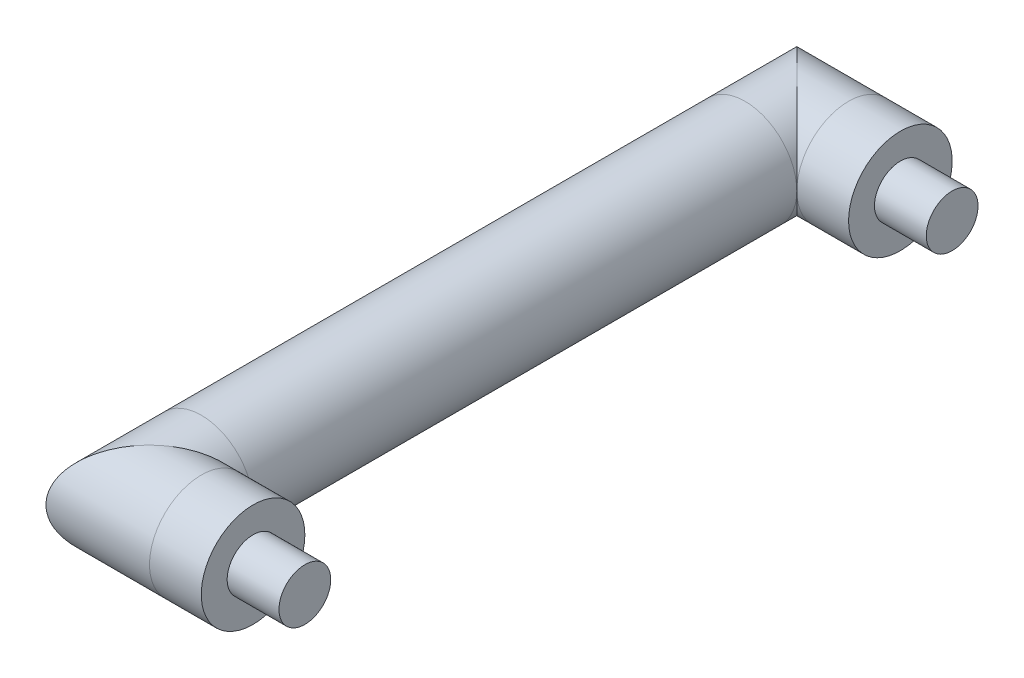
ISO-10303-21;
HEADER;
FILE_DESCRIPTION(('STEP AP214'),'2;1');
FILE_NAME('part.step','',(''),(''),'','','');
FILE_SCHEMA(('AUTOMOTIVE_DESIGN { 1 0 10303 214 1 1 1 1 }'));
ENDSEC;
DATA;
#1=APPLICATION_CONTEXT('core data for automotive mechanical design processes');
#2=APPLICATION_PROTOCOL_DEFINITION('international standard','automotive_design',2000,#1);
#3=PRODUCT_CONTEXT('',#1,'mechanical');
#4=PRODUCT('Part','Part','',(#3));
#5=PRODUCT_RELATED_PRODUCT_CATEGORY('part','',(#4));
#6=PRODUCT_DEFINITION_FORMATION('','',#4);
#7=PRODUCT_DEFINITION_CONTEXT('part definition',#1,'design');
#8=PRODUCT_DEFINITION('design','',#6,#7);
#9=PRODUCT_DEFINITION_SHAPE('','',#8);
#10=(LENGTH_UNIT() NAMED_UNIT(*) SI_UNIT(.MILLI.,.METRE.));
#11=(NAMED_UNIT(*) PLANE_ANGLE_UNIT() SI_UNIT($,.RADIAN.));
#12=(NAMED_UNIT(*) SI_UNIT($,.STERADIAN.) SOLID_ANGLE_UNIT());
#13=UNCERTAINTY_MEASURE_WITH_UNIT(LENGTH_MEASURE(1.E-05),#10,'distance_accuracy_value','');
#14=(GEOMETRIC_REPRESENTATION_CONTEXT(3) GLOBAL_UNCERTAINTY_ASSIGNED_CONTEXT((#13)) GLOBAL_UNIT_ASSIGNED_CONTEXT((#10,
#11,#12)) REPRESENTATION_CONTEXT('',''));
#15=CARTESIAN_POINT('',(0.,0.,0.));
#16=DIRECTION('',(0.,0.,1.));
#17=DIRECTION('',(1.,0.,0.));
#18=AXIS2_PLACEMENT_3D('',#15,#16,#17);
#19=CARTESIAN_POINT('',(0.,0.,0.));
#20=DIRECTION('',(1.,0.,0.));
#21=DIRECTION('',(0.,0.,-1.));
#22=AXIS2_PLACEMENT_3D('',#19,#20,#21);
#23=PLANE('',#22);
#24=CARTESIAN_POINT('',(0.,0.,0.));
#25=DIRECTION('',(1.,0.,0.));
#26=DIRECTION('',(0.,0.,-1.));
#27=AXIS2_PLACEMENT_3D('',#24,#25,#26);
#28=CIRCLE('',#27,10.);
#29=CARTESIAN_POINT('',(0.,0.,-10.));
#30=VERTEX_POINT('',#29);
#31=EDGE_CURVE('E11',#30,#30,#28,.T.);
#32=ORIENTED_EDGE('',*,*,#31,.F.);
#33=EDGE_LOOP('',(#32));
#34=FACE_BOUND('',#33,.T.);
#35=CARTESIAN_POINT('',(0.,0.,0.));
#36=DIRECTION('',(1.,0.,0.));
#37=DIRECTION('',(0.,0.,-1.));
#38=AXIS2_PLACEMENT_3D('',#35,#36,#37);
#39=CIRCLE('',#38,20.);
#40=CARTESIAN_POINT('',(0.,0.,-20.));
#41=VERTEX_POINT('',#40);
#42=EDGE_CURVE('E56',#41,#41,#39,.T.);
#43=ORIENTED_EDGE('',*,*,#42,.T.);
#44=EDGE_LOOP('',(#43));
#45=FACE_BOUND('',#44,.T.);
#46=ADVANCED_FACE('F47',(#34,#45),#23,.T.);
#47=CARTESIAN_POINT('',(-40.,0.,22.1));
#48=DIRECTION('',(0.,0.,-1.));
#49=DIRECTION('',(-1.,0.,0.));
#50=AXIS2_PLACEMENT_3D('',#47,#48,#49);
#51=CYLINDRICAL_SURFACE('',#50,20.);
#52=CARTESIAN_POINT('',(-40.,0.,-20.0000000000001));
#53=DIRECTION('',(0.,0.,1.));
#54=DIRECTION('',(1.,0.,0.));
#55=AXIS2_PLACEMENT_3D('',#52,#53,#54);
#56=CIRCLE('',#55,20.);
#57=CARTESIAN_POINT('',(-20.,0.,-20.));
#58=VERTEX_POINT('',#57);
#59=EDGE_CURVE('E50',#58,#58,#56,.T.);
#60=ORIENTED_EDGE('',*,*,#59,.T.);
#61=CARTESIAN_POINT('',(-40.,0.,0.));
#62=DIRECTION('',(-0.707106781186548,0.,-0.707106781186547));
#63=DIRECTION('',(-0.707106781186547,0.,0.707106781186548));
#64=AXIS2_PLACEMENT_3D('',#61,#62,#63);
#65=ELLIPSE('',#64,28.2842712474619,20.);
#66=EDGE_CURVE('E63',#58,#58,#65,.T.);
#67=ORIENTED_EDGE('',*,*,#66,.T.);
#68=EDGE_LOOP('',(#60,#67));
#69=FACE_BOUND('',#68,.T.);
#70=ADVANCED_FACE('F110',(#69),#51,.T.);
#71=CARTESIAN_POINT('',(-40.,0.,-20.0000000000001));
#72=DIRECTION('',(0.,0.,-1.));
#73=DIRECTION('',(-1.,0.,0.));
#74=AXIS2_PLACEMENT_3D('',#71,#72,#73);
#75=CYLINDRICAL_SURFACE('',#74,20.);
#76=ORIENTED_EDGE('',*,*,#59,.F.);
#77=EDGE_LOOP('',(#76));
#78=FACE_BOUND('',#77,.T.);
#79=CARTESIAN_POINT('',(-40.,0.,-230.));
#80=DIRECTION('',(0.,0.,1.));
#81=DIRECTION('',(1.,0.,0.));
#82=AXIS2_PLACEMENT_3D('',#79,#80,#81);
#83=CIRCLE('',#82,20.);
#84=CARTESIAN_POINT('',(-20.,0.,-230.));
#85=VERTEX_POINT('',#84);
#86=EDGE_CURVE('E83',#85,#85,#83,.T.);
#87=ORIENTED_EDGE('',*,*,#86,.T.);
#88=EDGE_LOOP('',(#87));
#89=FACE_BOUND('',#88,.T.);
#90=ADVANCED_FACE('F112',(#78,#89),#75,.T.);
#91=CARTESIAN_POINT('',(0.,0.,0.));
#92=DIRECTION('',(-1.,0.,0.));
#93=DIRECTION('',(0.,0.,1.));
#94=AXIS2_PLACEMENT_3D('',#91,#92,#93);
#95=CYLINDRICAL_SURFACE('',#94,20.);
#96=CARTESIAN_POINT('',(-19.9999999999999,0.,0.));
#97=DIRECTION('',(1.,0.,0.));
#98=DIRECTION('',(0.,0.,-1.));
#99=AXIS2_PLACEMENT_3D('',#96,#97,#98);
#100=CIRCLE('',#99,20.);
#101=EDGE_CURVE('E96',#58,#58,#100,.T.);
#102=ORIENTED_EDGE('',*,*,#101,.T.);
#103=EDGE_LOOP('',(#102));
#104=FACE_BOUND('',#103,.T.);
#105=ORIENTED_EDGE('',*,*,#42,.F.);
#106=EDGE_LOOP('',(#105));
#107=FACE_BOUND('',#106,.T.);
#108=ADVANCED_FACE('F115',(#104,#107),#95,.T.);
#109=CARTESIAN_POINT('',(-19.9999999999999,0.,0.));
#110=DIRECTION('',(-1.,0.,0.));
#111=DIRECTION('',(0.,0.,1.));
#112=AXIS2_PLACEMENT_3D('',#109,#110,#111);
#113=CYLINDRICAL_SURFACE('',#112,20.);
#114=ORIENTED_EDGE('',*,*,#101,.F.);
#115=ORIENTED_EDGE('',*,*,#66,.F.);
#116=EDGE_LOOP('',(#114,#115));
#117=FACE_BOUND('',#116,.T.);
#118=ADVANCED_FACE('F133',(#117),#113,.T.);
#119=CARTESIAN_POINT('',(20.,0.,0.));
#120=DIRECTION('',(-1.,0.,0.));
#121=DIRECTION('',(0.,0.,1.));
#122=AXIS2_PLACEMENT_3D('',#119,#120,#121);
#123=CYLINDRICAL_SURFACE('',#122,10.);
#124=CARTESIAN_POINT('',(20.,0.,0.));
#125=DIRECTION('',(1.,0.,0.));
#126=DIRECTION('',(0.,0.,-1.));
#127=AXIS2_PLACEMENT_3D('',#124,#125,#126);
#128=CIRCLE('',#127,10.);
#129=CARTESIAN_POINT('',(20.,0.,-10.));
#130=VERTEX_POINT('',#129);
#131=EDGE_CURVE('E92',#130,#130,#128,.T.);
#132=ORIENTED_EDGE('',*,*,#131,.F.);
#133=EDGE_LOOP('',(#132));
#134=FACE_BOUND('',#133,.T.);
#135=ORIENTED_EDGE('',*,*,#31,.T.);
#136=EDGE_LOOP('',(#135));
#137=FACE_BOUND('',#136,.T.);
#138=ADVANCED_FACE('F135',(#134,#137),#123,.T.);
#139=CARTESIAN_POINT('',(20.,0.,0.));
#140=DIRECTION('',(1.,0.,0.));
#141=DIRECTION('',(0.,0.,-1.));
#142=AXIS2_PLACEMENT_3D('',#139,#140,#141);
#143=PLANE('',#142);
#144=ORIENTED_EDGE('',*,*,#131,.T.);
#145=EDGE_LOOP('',(#144));
#146=FACE_BOUND('',#145,.T.);
#147=ADVANCED_FACE('F129',(#146),#143,.T.);
#148=CARTESIAN_POINT('',(0.,0.,-250.));
#149=DIRECTION('',(1.,0.,0.));
#150=DIRECTION('',(0.,0.,1.));
#151=AXIS2_PLACEMENT_3D('',#148,#149,#150);
#152=PLANE('',#151);
#153=CARTESIAN_POINT('',(0.,0.,-250.));
#154=DIRECTION('',(-1.,0.,0.));
#155=DIRECTION('',(0.,0.,1.));
#156=AXIS2_PLACEMENT_3D('',#153,#154,#155);
#157=CIRCLE('',#156,10.);
#158=CARTESIAN_POINT('',(0.,0.,-240.));
#159=VERTEX_POINT('',#158);
#160=EDGE_CURVE('E80',#159,#159,#157,.T.);
#161=ORIENTED_EDGE('',*,*,#160,.T.);
#162=EDGE_LOOP('',(#161));
#163=FACE_BOUND('',#162,.T.);
#164=CARTESIAN_POINT('',(0.,0.,-250.));
#165=DIRECTION('',(-1.,0.,0.));
#166=DIRECTION('',(0.,0.,1.));
#167=AXIS2_PLACEMENT_3D('',#164,#165,#166);
#168=CIRCLE('',#167,20.);
#169=CARTESIAN_POINT('',(0.,0.,-230.));
#170=VERTEX_POINT('',#169);
#171=EDGE_CURVE('E75',#170,#170,#168,.T.);
#172=ORIENTED_EDGE('',*,*,#171,.F.);
#173=EDGE_LOOP('',(#172));
#174=FACE_BOUND('',#173,.T.);
#175=ADVANCED_FACE('F122',(#163,#174),#152,.T.);
#176=CARTESIAN_POINT('',(-40.,0.,-272.1));
#177=DIRECTION('',(0.,0.,1.));
#178=DIRECTION('',(-1.,0.,0.));
#179=AXIS2_PLACEMENT_3D('',#176,#177,#178);
#180=CYLINDRICAL_SURFACE('',#179,20.);
#181=ORIENTED_EDGE('',*,*,#86,.F.);
#182=CARTESIAN_POINT('',(-40.,0.,-250.));
#183=DIRECTION('',(0.707106781186547,0.,-0.707106781186548));
#184=DIRECTION('',(-0.707106781186548,0.,-0.707106781186547));
#185=AXIS2_PLACEMENT_3D('',#182,#183,#184);
#186=ELLIPSE('',#185,28.2842712474619,20.);
#187=EDGE_CURVE('E72',#85,#85,#186,.T.);
#188=ORIENTED_EDGE('',*,*,#187,.F.);
#189=EDGE_LOOP('',(#181,#188));
#190=FACE_BOUND('',#189,.T.);
#191=ADVANCED_FACE('F119',(#190),#180,.T.);
#192=CARTESIAN_POINT('',(0.,0.,-250.));
#193=DIRECTION('',(-1.,0.,0.));
#194=DIRECTION('',(0.,0.,-1.));
#195=AXIS2_PLACEMENT_3D('',#192,#193,#194);
#196=CYLINDRICAL_SURFACE('',#195,20.);
#197=CARTESIAN_POINT('',(-19.9999999999999,0.,-250.));
#198=DIRECTION('',(-1.,0.,0.));
#199=DIRECTION('',(0.,0.,1.));
#200=AXIS2_PLACEMENT_3D('',#197,#198,#199);
#201=CIRCLE('',#200,20.);
#202=EDGE_CURVE('E69',#85,#85,#201,.T.);
#203=ORIENTED_EDGE('',*,*,#202,.F.);
#204=EDGE_LOOP('',(#203));
#205=FACE_BOUND('',#204,.T.);
#206=ORIENTED_EDGE('',*,*,#171,.T.);
#207=EDGE_LOOP('',(#206));
#208=FACE_BOUND('',#207,.T.);
#209=ADVANCED_FACE('F121',(#205,#208),#196,.T.);
#210=CARTESIAN_POINT('',(-19.9999999999999,0.,-250.));
#211=DIRECTION('',(-1.,0.,0.));
#212=DIRECTION('',(0.,0.,-1.));
#213=AXIS2_PLACEMENT_3D('',#210,#211,#212);
#214=CYLINDRICAL_SURFACE('',#213,20.);
#215=ORIENTED_EDGE('',*,*,#202,.T.);
#216=ORIENTED_EDGE('',*,*,#187,.T.);
#217=EDGE_LOOP('',(#215,#216));
#218=FACE_BOUND('',#217,.T.);
#219=ADVANCED_FACE('F70',(#218),#214,.T.);
#220=CARTESIAN_POINT('',(20.,0.,-250.));
#221=DIRECTION('',(-1.,0.,0.));
#222=DIRECTION('',(0.,0.,-1.));
#223=AXIS2_PLACEMENT_3D('',#220,#221,#222);
#224=CYLINDRICAL_SURFACE('',#223,10.);
#225=CARTESIAN_POINT('',(20.,0.,-250.));
#226=DIRECTION('',(-1.,0.,0.));
#227=DIRECTION('',(0.,0.,1.));
#228=AXIS2_PLACEMENT_3D('',#225,#226,#227);
#229=CIRCLE('',#228,10.);
#230=CARTESIAN_POINT('',(20.,0.,-240.));
#231=VERTEX_POINT('',#230);
#232=EDGE_CURVE('E91',#231,#231,#229,.T.);
#233=ORIENTED_EDGE('',*,*,#232,.T.);
#234=EDGE_LOOP('',(#233));
#235=FACE_BOUND('',#234,.T.);
#236=ORIENTED_EDGE('',*,*,#160,.F.);
#237=EDGE_LOOP('',(#236));
#238=FACE_BOUND('',#237,.T.);
#239=ADVANCED_FACE('F209',(#235,#238),#224,.T.);
#240=CARTESIAN_POINT('',(20.,0.,-250.));
#241=DIRECTION('',(1.,0.,0.));
#242=DIRECTION('',(0.,0.,1.));
#243=AXIS2_PLACEMENT_3D('',#240,#241,#242);
#244=PLANE('',#243);
#245=ORIENTED_EDGE('',*,*,#232,.F.);
#246=EDGE_LOOP('',(#245));
#247=FACE_BOUND('',#246,.T.);
#248=ADVANCED_FACE('F216',(#247),#244,.T.);
#249=CLOSED_SHELL('',(#46,#70,#90,#108,#118,#138,#147,#175,#191,#209,#219,#239,#248));
#250=MANIFOLD_SOLID_BREP('B2',#249);
#251=ADVANCED_BREP_SHAPE_REPRESENTATION('',(#18,#250),#14);
#252=SHAPE_DEFINITION_REPRESENTATION(#9,#251);
ENDSEC;
END-ISO-10303-21;
